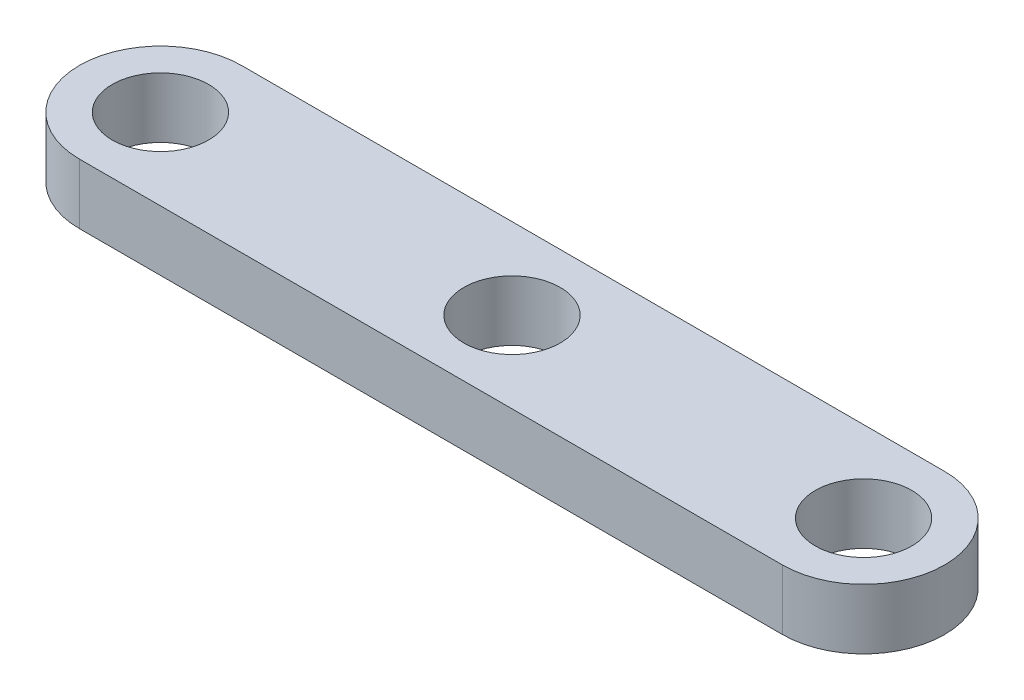
ISO-10303-21;
HEADER;
FILE_DESCRIPTION(('STEP AP214'),'2;1');
FILE_NAME('part.step','',(''),(''),'','','');
FILE_SCHEMA(('AUTOMOTIVE_DESIGN { 1 0 10303 214 1 1 1 1 }'));
ENDSEC;
DATA;
#1=APPLICATION_CONTEXT('core data for automotive mechanical design processes');
#2=APPLICATION_PROTOCOL_DEFINITION('international standard','automotive_design',2000,#1);
#3=PRODUCT_CONTEXT('',#1,'mechanical');
#4=PRODUCT('Part','Part','',(#3));
#5=PRODUCT_RELATED_PRODUCT_CATEGORY('part','',(#4));
#6=PRODUCT_DEFINITION_FORMATION('','',#4);
#7=PRODUCT_DEFINITION_CONTEXT('part definition',#1,'design');
#8=PRODUCT_DEFINITION('design','',#6,#7);
#9=PRODUCT_DEFINITION_SHAPE('','',#8);
#10=(LENGTH_UNIT() NAMED_UNIT(*) SI_UNIT(.MILLI.,.METRE.));
#11=(NAMED_UNIT(*) PLANE_ANGLE_UNIT() SI_UNIT($,.RADIAN.));
#12=(NAMED_UNIT(*) SI_UNIT($,.STERADIAN.) SOLID_ANGLE_UNIT());
#13=UNCERTAINTY_MEASURE_WITH_UNIT(LENGTH_MEASURE(1.E-05),#10,'distance_accuracy_value','');
#14=(GEOMETRIC_REPRESENTATION_CONTEXT(3) GLOBAL_UNCERTAINTY_ASSIGNED_CONTEXT((#13)) GLOBAL_UNIT_ASSIGNED_CONTEXT((#10,
#11,#12)) REPRESENTATION_CONTEXT('',''));
#15=CARTESIAN_POINT('',(0.,0.,0.));
#16=DIRECTION('',(0.,0.,1.));
#17=DIRECTION('',(1.,0.,0.));
#18=AXIS2_PLACEMENT_3D('',#15,#16,#17);
#19=CARTESIAN_POINT('',(0.,3.,4.035));
#20=DIRECTION('',(0.,0.,-1.));
#21=DIRECTION('',(-1.,0.,0.));
#22=AXIS2_PLACEMENT_3D('',#19,#20,#21);
#23=PLANE('',#22);
#24=DIRECTION('',(1.,0.,0.));
#25=VECTOR('',#24,1.);
#26=CARTESIAN_POINT('',(0.,0.,4.035));
#27=LINE('',#26,#25);
#28=CARTESIAN_POINT('',(-17.5,0.,4.035));
#29=VERTEX_POINT('',#28);
#30=CARTESIAN_POINT('',(17.5,0.,4.035));
#31=VERTEX_POINT('',#30);
#32=EDGE_CURVE('E113',#29,#31,#27,.T.);
#33=ORIENTED_EDGE('',*,*,#32,.T.);
#34=DIRECTION('',(0.,-1.,0.));
#35=VECTOR('',#34,1.);
#36=CARTESIAN_POINT('',(17.5,3.,4.035));
#37=LINE('',#36,#35);
#38=CARTESIAN_POINT('',(17.5,3.,4.035));
#39=VERTEX_POINT('',#38);
#40=EDGE_CURVE('E11',#39,#31,#37,.T.);
#41=ORIENTED_EDGE('',*,*,#40,.F.);
#42=DIRECTION('',(1.,0.,0.));
#43=VECTOR('',#42,1.);
#44=CARTESIAN_POINT('',(0.,3.,4.035));
#45=LINE('',#44,#43);
#46=CARTESIAN_POINT('',(-17.5,3.,4.035));
#47=VERTEX_POINT('',#46);
#48=EDGE_CURVE('E89',#47,#39,#45,.T.);
#49=ORIENTED_EDGE('',*,*,#48,.F.);
#50=DIRECTION('',(0.,-1.,0.));
#51=VECTOR('',#50,1.);
#52=CARTESIAN_POINT('',(-17.5,3.,4.035));
#53=LINE('',#52,#51);
#54=EDGE_CURVE('E100',#47,#29,#53,.T.);
#55=ORIENTED_EDGE('',*,*,#54,.T.);
#56=EDGE_LOOP('',(#33,#41,#49,#55));
#57=FACE_BOUND('',#56,.T.);
#58=ADVANCED_FACE('F41',(#57),#23,.F.);
#59=CARTESIAN_POINT('',(17.5,3.,0.));
#60=DIRECTION('',(0.,-1.,0.));
#61=DIRECTION('',(0.,0.,-1.));
#62=AXIS2_PLACEMENT_3D('',#59,#60,#61);
#63=CYLINDRICAL_SURFACE('',#62,4.035);
#64=CARTESIAN_POINT('',(17.5,0.,0.));
#65=DIRECTION('',(0.,1.,0.));
#66=DIRECTION('',(0.,0.,1.));
#67=AXIS2_PLACEMENT_3D('',#64,#65,#66);
#68=CIRCLE('',#67,4.035);
#69=CARTESIAN_POINT('',(17.5,0.,-4.035));
#70=VERTEX_POINT('',#69);
#71=EDGE_CURVE('E94',#31,#70,#68,.T.);
#72=ORIENTED_EDGE('',*,*,#71,.T.);
#73=DIRECTION('',(0.,-1.,0.));
#74=VECTOR('',#73,1.);
#75=CARTESIAN_POINT('',(17.5,3.,-4.035));
#76=LINE('',#75,#74);
#77=CARTESIAN_POINT('',(17.5,3.,-4.035));
#78=VERTEX_POINT('',#77);
#79=EDGE_CURVE('E50',#78,#70,#76,.T.);
#80=ORIENTED_EDGE('',*,*,#79,.F.);
#81=CARTESIAN_POINT('',(17.5,3.,0.));
#82=DIRECTION('',(0.,1.,0.));
#83=DIRECTION('',(0.,0.,1.));
#84=AXIS2_PLACEMENT_3D('',#81,#82,#83);
#85=CIRCLE('',#84,4.035);
#86=EDGE_CURVE('E84',#39,#78,#85,.T.);
#87=ORIENTED_EDGE('',*,*,#86,.F.);
#88=ORIENTED_EDGE('',*,*,#40,.T.);
#89=EDGE_LOOP('',(#72,#80,#87,#88));
#90=FACE_BOUND('',#89,.T.);
#91=ADVANCED_FACE('F93',(#90),#63,.T.);
#92=CARTESIAN_POINT('',(0.,3.,-4.035));
#93=DIRECTION('',(0.,0.,-1.));
#94=DIRECTION('',(-1.,0.,0.));
#95=AXIS2_PLACEMENT_3D('',#92,#93,#94);
#96=PLANE('',#95);
#97=DIRECTION('',(1.,0.,0.));
#98=VECTOR('',#97,1.);
#99=CARTESIAN_POINT('',(0.,0.,-4.035));
#100=LINE('',#99,#98);
#101=CARTESIAN_POINT('',(-17.5,0.,-4.035));
#102=VERTEX_POINT('',#101);
#103=EDGE_CURVE('E117',#102,#70,#100,.T.);
#104=ORIENTED_EDGE('',*,*,#103,.F.);
#105=DIRECTION('',(0.,-1.,0.));
#106=VECTOR('',#105,1.);
#107=CARTESIAN_POINT('',(-17.5,3.,-4.035));
#108=LINE('',#107,#106);
#109=CARTESIAN_POINT('',(-17.5,3.,-4.035));
#110=VERTEX_POINT('',#109);
#111=EDGE_CURVE('E74',#110,#102,#108,.T.);
#112=ORIENTED_EDGE('',*,*,#111,.F.);
#113=DIRECTION('',(1.,0.,0.));
#114=VECTOR('',#113,1.);
#115=CARTESIAN_POINT('',(0.,3.,-4.035));
#116=LINE('',#115,#114);
#117=EDGE_CURVE('E87',#110,#78,#116,.T.);
#118=ORIENTED_EDGE('',*,*,#117,.T.);
#119=ORIENTED_EDGE('',*,*,#79,.T.);
#120=EDGE_LOOP('',(#104,#112,#118,#119));
#121=FACE_BOUND('',#120,.T.);
#122=ADVANCED_FACE('F98',(#121),#96,.T.);
#123=CARTESIAN_POINT('',(-17.5,3.,0.));
#124=DIRECTION('',(0.,-1.,0.));
#125=DIRECTION('',(0.,0.,-1.));
#126=AXIS2_PLACEMENT_3D('',#123,#124,#125);
#127=CYLINDRICAL_SURFACE('',#126,2.4);
#128=CARTESIAN_POINT('',(-17.5,3.,0.));
#129=DIRECTION('',(0.,1.,0.));
#130=DIRECTION('',(0.,0.,1.));
#131=AXIS2_PLACEMENT_3D('',#128,#129,#130);
#132=CIRCLE('',#131,2.4);
#133=CARTESIAN_POINT('',(-17.5,3.,2.4));
#134=VERTEX_POINT('',#133);
#135=EDGE_CURVE('E164',#134,#134,#132,.T.);
#136=ORIENTED_EDGE('',*,*,#135,.T.);
#137=EDGE_LOOP('',(#136));
#138=FACE_BOUND('',#137,.T.);
#139=CARTESIAN_POINT('',(-17.5,0.,0.));
#140=DIRECTION('',(0.,1.,0.));
#141=DIRECTION('',(0.,0.,1.));
#142=AXIS2_PLACEMENT_3D('',#139,#140,#141);
#143=CIRCLE('',#142,2.4);
#144=CARTESIAN_POINT('',(-17.5,0.,2.4));
#145=VERTEX_POINT('',#144);
#146=EDGE_CURVE('E110',#145,#145,#143,.T.);
#147=ORIENTED_EDGE('',*,*,#146,.F.);
#148=EDGE_LOOP('',(#147));
#149=FACE_BOUND('',#148,.T.);
#150=ADVANCED_FACE('F145',(#138,#149),#127,.F.);
#151=CARTESIAN_POINT('',(17.5,3.,0.));
#152=DIRECTION('',(0.,-1.,0.));
#153=DIRECTION('',(0.,0.,-1.));
#154=AXIS2_PLACEMENT_3D('',#151,#152,#153);
#155=CYLINDRICAL_SURFACE('',#154,2.4);
#156=CARTESIAN_POINT('',(17.5,3.,0.));
#157=DIRECTION('',(0.,1.,0.));
#158=DIRECTION('',(0.,0.,1.));
#159=AXIS2_PLACEMENT_3D('',#156,#157,#158);
#160=CIRCLE('',#159,2.4);
#161=CARTESIAN_POINT('',(17.5,3.,2.4));
#162=VERTEX_POINT('',#161);
#163=EDGE_CURVE('E158',#162,#162,#160,.T.);
#164=ORIENTED_EDGE('',*,*,#163,.T.);
#165=EDGE_LOOP('',(#164));
#166=FACE_BOUND('',#165,.T.);
#167=CARTESIAN_POINT('',(17.5,0.,0.));
#168=DIRECTION('',(0.,1.,0.));
#169=DIRECTION('',(0.,0.,1.));
#170=AXIS2_PLACEMENT_3D('',#167,#168,#169);
#171=CIRCLE('',#170,2.4);
#172=CARTESIAN_POINT('',(17.5,0.,2.4));
#173=VERTEX_POINT('',#172);
#174=EDGE_CURVE('E107',#173,#173,#171,.T.);
#175=ORIENTED_EDGE('',*,*,#174,.F.);
#176=EDGE_LOOP('',(#175));
#177=FACE_BOUND('',#176,.T.);
#178=ADVANCED_FACE('F147',(#166,#177),#155,.F.);
#179=CARTESIAN_POINT('',(0.,3.,0.));
#180=DIRECTION('',(0.,-1.,0.));
#181=DIRECTION('',(0.,0.,-1.));
#182=AXIS2_PLACEMENT_3D('',#179,#180,#181);
#183=CYLINDRICAL_SURFACE('',#182,2.4);
#184=CARTESIAN_POINT('',(0.,3.,0.));
#185=DIRECTION('',(0.,1.,0.));
#186=DIRECTION('',(0.,0.,1.));
#187=AXIS2_PLACEMENT_3D('',#184,#185,#186);
#188=CIRCLE('',#187,2.4);
#189=CARTESIAN_POINT('',(0.,3.,2.4));
#190=VERTEX_POINT('',#189);
#191=EDGE_CURVE('E120',#190,#190,#188,.T.);
#192=ORIENTED_EDGE('',*,*,#191,.T.);
#193=EDGE_LOOP('',(#192));
#194=FACE_BOUND('',#193,.T.);
#195=CARTESIAN_POINT('',(0.,0.,0.));
#196=DIRECTION('',(0.,1.,0.));
#197=DIRECTION('',(0.,0.,1.));
#198=AXIS2_PLACEMENT_3D('',#195,#196,#197);
#199=CIRCLE('',#198,2.4);
#200=CARTESIAN_POINT('',(0.,0.,2.4));
#201=VERTEX_POINT('',#200);
#202=EDGE_CURVE('E104',#201,#201,#199,.T.);
#203=ORIENTED_EDGE('',*,*,#202,.F.);
#204=EDGE_LOOP('',(#203));
#205=FACE_BOUND('',#204,.T.);
#206=ADVANCED_FACE('F43',(#194,#205),#183,.F.);
#207=CARTESIAN_POINT('',(-17.5,3.,0.));
#208=DIRECTION('',(0.,-1.,0.));
#209=DIRECTION('',(0.,0.,-1.));
#210=AXIS2_PLACEMENT_3D('',#207,#208,#209);
#211=CYLINDRICAL_SURFACE('',#210,4.035);
#212=CARTESIAN_POINT('',(-17.5,0.,0.));
#213=DIRECTION('',(0.,1.,0.));
#214=DIRECTION('',(0.,0.,1.));
#215=AXIS2_PLACEMENT_3D('',#212,#213,#214);
#216=CIRCLE('',#215,4.035);
#217=EDGE_CURVE('E77',#102,#29,#216,.T.);
#218=ORIENTED_EDGE('',*,*,#217,.T.);
#219=ORIENTED_EDGE('',*,*,#54,.F.);
#220=CARTESIAN_POINT('',(-17.5,3.,0.));
#221=DIRECTION('',(0.,1.,0.));
#222=DIRECTION('',(0.,0.,1.));
#223=AXIS2_PLACEMENT_3D('',#220,#221,#222);
#224=CIRCLE('',#223,4.035);
#225=EDGE_CURVE('E58',#110,#47,#224,.T.);
#226=ORIENTED_EDGE('',*,*,#225,.F.);
#227=ORIENTED_EDGE('',*,*,#111,.T.);
#228=EDGE_LOOP('',(#218,#219,#226,#227));
#229=FACE_BOUND('',#228,.T.);
#230=ADVANCED_FACE('F132',(#229),#211,.T.);
#231=CARTESIAN_POINT('',(0.,3.,0.));
#232=DIRECTION('',(0.,1.,0.));
#233=DIRECTION('',(0.,0.,1.));
#234=AXIS2_PLACEMENT_3D('',#231,#232,#233);
#235=PLANE('',#234);
#236=ORIENTED_EDGE('',*,*,#191,.F.);
#237=EDGE_LOOP('',(#236));
#238=FACE_BOUND('',#237,.T.);
#239=ORIENTED_EDGE('',*,*,#163,.F.);
#240=EDGE_LOOP('',(#239));
#241=FACE_BOUND('',#240,.T.);
#242=ORIENTED_EDGE('',*,*,#135,.F.);
#243=EDGE_LOOP('',(#242));
#244=FACE_BOUND('',#243,.T.);
#245=ORIENTED_EDGE('',*,*,#48,.T.);
#246=ORIENTED_EDGE('',*,*,#86,.T.);
#247=ORIENTED_EDGE('',*,*,#117,.F.);
#248=ORIENTED_EDGE('',*,*,#225,.T.);
#249=EDGE_LOOP('',(#245,#246,#247,#248));
#250=FACE_BOUND('',#249,.T.);
#251=ADVANCED_FACE('F85',(#238,#241,#244,#250),#235,.T.);
#252=CARTESIAN_POINT('',(0.,0.,0.));
#253=DIRECTION('',(0.,1.,0.));
#254=DIRECTION('',(0.,0.,1.));
#255=AXIS2_PLACEMENT_3D('',#252,#253,#254);
#256=PLANE('',#255);
#257=ORIENTED_EDGE('',*,*,#202,.T.);
#258=EDGE_LOOP('',(#257));
#259=FACE_BOUND('',#258,.T.);
#260=ORIENTED_EDGE('',*,*,#174,.T.);
#261=EDGE_LOOP('',(#260));
#262=FACE_BOUND('',#261,.T.);
#263=ORIENTED_EDGE('',*,*,#146,.T.);
#264=EDGE_LOOP('',(#263));
#265=FACE_BOUND('',#264,.T.);
#266=ORIENTED_EDGE('',*,*,#32,.F.);
#267=ORIENTED_EDGE('',*,*,#217,.F.);
#268=ORIENTED_EDGE('',*,*,#103,.T.);
#269=ORIENTED_EDGE('',*,*,#71,.F.);
#270=EDGE_LOOP('',(#266,#267,#268,#269));
#271=FACE_BOUND('',#270,.T.);
#272=ADVANCED_FACE('F125',(#259,#262,#265,#271),#256,.F.);
#273=CLOSED_SHELL('',(#58,#91,#122,#150,#178,#206,#230,#251,#272));
#274=MANIFOLD_SOLID_BREP('B2',#273);
#275=ADVANCED_BREP_SHAPE_REPRESENTATION('',(#18,#274),#14);
#276=SHAPE_DEFINITION_REPRESENTATION(#9,#275);
ENDSEC;
END-ISO-10303-21;
